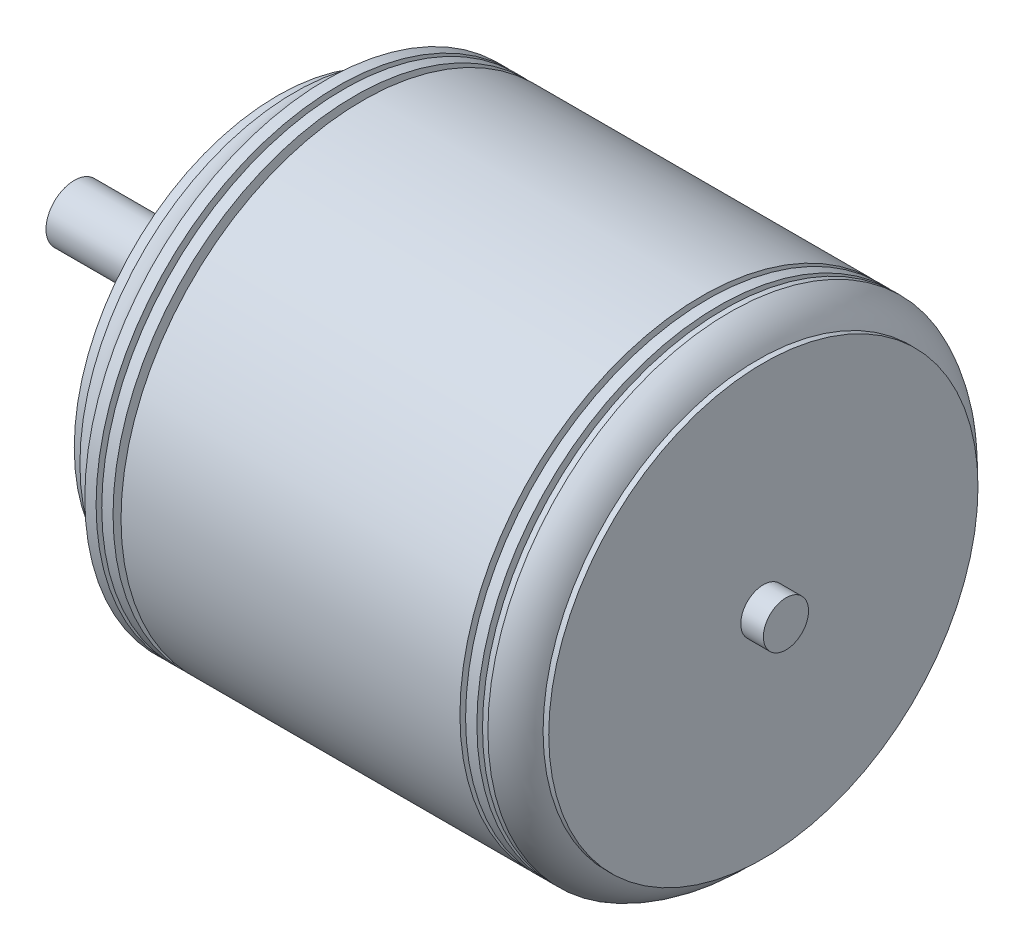
ISO-10303-21;
HEADER;
FILE_DESCRIPTION(('STEP AP214'),'2;1');
FILE_NAME('part.step','',(''),(''),'','','');
FILE_SCHEMA(('AUTOMOTIVE_DESIGN { 1 0 10303 214 1 1 1 1 }'));
ENDSEC;
DATA;
#1=APPLICATION_CONTEXT('core data for automotive mechanical design processes');
#2=APPLICATION_PROTOCOL_DEFINITION('international standard','automotive_design',2000,#1);
#3=PRODUCT_CONTEXT('',#1,'mechanical');
#4=PRODUCT('Part','Part','',(#3));
#5=PRODUCT_RELATED_PRODUCT_CATEGORY('part','',(#4));
#6=PRODUCT_DEFINITION_FORMATION('','',#4);
#7=PRODUCT_DEFINITION_CONTEXT('part definition',#1,'design');
#8=PRODUCT_DEFINITION('design','',#6,#7);
#9=PRODUCT_DEFINITION_SHAPE('','',#8);
#10=(LENGTH_UNIT() NAMED_UNIT(*) SI_UNIT(.MILLI.,.METRE.));
#11=(NAMED_UNIT(*) PLANE_ANGLE_UNIT() SI_UNIT($,.RADIAN.));
#12=(NAMED_UNIT(*) SI_UNIT($,.STERADIAN.) SOLID_ANGLE_UNIT());
#13=UNCERTAINTY_MEASURE_WITH_UNIT(LENGTH_MEASURE(1.E-05),#10,'distance_accuracy_value','');
#14=(GEOMETRIC_REPRESENTATION_CONTEXT(3) GLOBAL_UNCERTAINTY_ASSIGNED_CONTEXT((#13)) GLOBAL_UNIT_ASSIGNED_CONTEXT((#10,
#11,#12)) REPRESENTATION_CONTEXT('',''));
#15=CARTESIAN_POINT('',(0.,0.,0.));
#16=DIRECTION('',(0.,0.,1.));
#17=DIRECTION('',(1.,0.,0.));
#18=AXIS2_PLACEMENT_3D('',#15,#16,#17);
#19=CARTESIAN_POINT('',(154.955266755211,0.,0.));
#20=DIRECTION('',(-1.,0.,0.));
#21=DIRECTION('',(0.,0.,1.));
#22=AXIS2_PLACEMENT_3D('',#19,#20,#21);
#23=TOROIDAL_SURFACE('',#22,23.694590908256,4.94220442651231);
#24=CARTESIAN_POINT('',(159.332507570746,0.,0.));
#25=DIRECTION('',(-1.,0.,0.));
#26=DIRECTION('',(0.,0.,1.));
#27=AXIS2_PLACEMENT_3D('',#24,#25,#26);
#28=CIRCLE('',#27,21.4);
#29=CARTESIAN_POINT('',(159.332507570746,0.,21.4));
#30=VERTEX_POINT('',#29);
#31=EDGE_CURVE('E155',#30,#30,#28,.T.);
#32=ORIENTED_EDGE('',*,*,#31,.T.);
#33=EDGE_LOOP('',(#32));
#34=FACE_BOUND('',#33,.T.);
#35=CARTESIAN_POINT('',(156.5,0.,0.));
#36=DIRECTION('',(-1.,0.,0.));
#37=DIRECTION('',(0.,0.,1.));
#38=AXIS2_PLACEMENT_3D('',#35,#36,#37);
#39=CIRCLE('',#38,19.);
#40=CARTESIAN_POINT('',(156.5,0.,19.));
#41=VERTEX_POINT('',#40);
#42=EDGE_CURVE('E10',#41,#41,#39,.T.);
#43=ORIENTED_EDGE('',*,*,#42,.F.);
#44=EDGE_LOOP('',(#43));
#45=FACE_BOUND('',#44,.T.);
#46=ADVANCED_FACE('F44',(#34,#45),#23,.F.);
#47=CARTESIAN_POINT('',(156.5,0.,0.));
#48=DIRECTION('',(1.,0.,0.));
#49=DIRECTION('',(0.,0.,-1.));
#50=AXIS2_PLACEMENT_3D('',#47,#48,#49);
#51=PLANE('',#50);
#52=CARTESIAN_POINT('',(156.5,0.,0.));
#53=DIRECTION('',(-1.,0.,0.));
#54=DIRECTION('',(0.,0.,1.));
#55=AXIS2_PLACEMENT_3D('',#52,#53,#54);
#56=CIRCLE('',#55,18.);
#57=CARTESIAN_POINT('',(156.5,0.,18.));
#58=VERTEX_POINT('',#57);
#59=EDGE_CURVE('E51',#58,#58,#56,.T.);
#60=ORIENTED_EDGE('',*,*,#59,.F.);
#61=EDGE_LOOP('',(#60));
#62=FACE_BOUND('',#61,.T.);
#63=ORIENTED_EDGE('',*,*,#42,.T.);
#64=EDGE_LOOP('',(#63));
#65=FACE_BOUND('',#64,.T.);
#66=ADVANCED_FACE('F174',(#62,#65),#51,.F.);
#67=CARTESIAN_POINT('',(0.,0.,0.));
#68=DIRECTION('',(-1.,0.,0.));
#69=DIRECTION('',(0.,0.,1.));
#70=AXIS2_PLACEMENT_3D('',#67,#68,#69);
#71=CYLINDRICAL_SURFACE('',#70,18.);
#72=CARTESIAN_POINT('',(155.,0.,0.));
#73=DIRECTION('',(-1.,0.,0.));
#74=DIRECTION('',(0.,0.,1.));
#75=AXIS2_PLACEMENT_3D('',#72,#73,#74);
#76=CIRCLE('',#75,18.);
#77=CARTESIAN_POINT('',(155.,0.,18.));
#78=VERTEX_POINT('',#77);
#79=EDGE_CURVE('E56',#78,#78,#76,.T.);
#80=ORIENTED_EDGE('',*,*,#79,.F.);
#81=EDGE_LOOP('',(#80));
#82=FACE_BOUND('',#81,.T.);
#83=ORIENTED_EDGE('',*,*,#59,.T.);
#84=EDGE_LOOP('',(#83));
#85=FACE_BOUND('',#84,.T.);
#86=ADVANCED_FACE('F178',(#82,#85),#71,.T.);
#87=CARTESIAN_POINT('',(155.,0.,0.));
#88=DIRECTION('',(-1.,0.,0.));
#89=DIRECTION('',(0.,0.,1.));
#90=AXIS2_PLACEMENT_3D('',#87,#88,#89);
#91=PLANE('',#90);
#92=ORIENTED_EDGE('',*,*,#79,.T.);
#93=EDGE_LOOP('',(#92));
#94=FACE_BOUND('',#93,.T.);
#95=CARTESIAN_POINT('',(155.,0.,0.));
#96=DIRECTION('',(-1.,0.,0.));
#97=DIRECTION('',(0.,0.,1.));
#98=AXIS2_PLACEMENT_3D('',#95,#96,#97);
#99=CIRCLE('',#98,2.5);
#100=CARTESIAN_POINT('',(155.,0.,2.5));
#101=VERTEX_POINT('',#100);
#102=EDGE_CURVE('E61',#101,#101,#99,.T.);
#103=ORIENTED_EDGE('',*,*,#102,.F.);
#104=EDGE_LOOP('',(#103));
#105=FACE_BOUND('',#104,.T.);
#106=ADVANCED_FACE('F183',(#94,#105),#91,.T.);
#107=CARTESIAN_POINT('',(0.,0.,0.));
#108=DIRECTION('',(-1.,0.,0.));
#109=DIRECTION('',(0.,0.,1.));
#110=AXIS2_PLACEMENT_3D('',#107,#108,#109);
#111=CYLINDRICAL_SURFACE('',#110,2.5);
#112=CARTESIAN_POINT('',(137.,0.,0.));
#113=DIRECTION('',(-1.,0.,0.));
#114=DIRECTION('',(0.,0.,1.));
#115=AXIS2_PLACEMENT_3D('',#112,#113,#114);
#116=CIRCLE('',#115,2.5);
#117=CARTESIAN_POINT('',(137.,0.,2.5));
#118=VERTEX_POINT('',#117);
#119=EDGE_CURVE('E67',#118,#118,#116,.T.);
#120=ORIENTED_EDGE('',*,*,#119,.F.);
#121=EDGE_LOOP('',(#120));
#122=FACE_BOUND('',#121,.T.);
#123=ORIENTED_EDGE('',*,*,#102,.T.);
#124=EDGE_LOOP('',(#123));
#125=FACE_BOUND('',#124,.T.);
#126=ADVANCED_FACE('F189',(#122,#125),#111,.T.);
#127=CARTESIAN_POINT('',(137.,0.,0.));
#128=DIRECTION('',(1.,0.,0.));
#129=DIRECTION('',(0.,0.,-1.));
#130=AXIS2_PLACEMENT_3D('',#127,#128,#129);
#131=PLANE('',#130);
#132=ORIENTED_EDGE('',*,*,#119,.T.);
#133=EDGE_LOOP('',(#132));
#134=FACE_BOUND('',#133,.T.);
#135=ADVANCED_FACE('F193',(#134),#131,.F.);
#136=CARTESIAN_POINT('',(200.,0.,0.));
#137=DIRECTION('',(-1.,0.,0.));
#138=DIRECTION('',(0.,0.,1.));
#139=AXIS2_PLACEMENT_3D('',#136,#137,#138);
#140=PLANE('',#139);
#141=CARTESIAN_POINT('',(200.,0.,0.));
#142=DIRECTION('',(-1.,0.,0.));
#143=DIRECTION('',(0.,0.,1.));
#144=AXIS2_PLACEMENT_3D('',#141,#142,#143);
#145=CIRCLE('',#144,2.);
#146=CARTESIAN_POINT('',(200.,0.,2.));
#147=VERTEX_POINT('',#146);
#148=EDGE_CURVE('E71',#147,#147,#145,.T.);
#149=ORIENTED_EDGE('',*,*,#148,.F.);
#150=EDGE_LOOP('',(#149));
#151=FACE_BOUND('',#150,.T.);
#152=ADVANCED_FACE('F197',(#151),#140,.F.);
#153=CARTESIAN_POINT('',(0.,0.,0.));
#154=DIRECTION('',(-1.,0.,0.));
#155=DIRECTION('',(0.,0.,1.));
#156=AXIS2_PLACEMENT_3D('',#153,#154,#155);
#157=CYLINDRICAL_SURFACE('',#156,2.);
#158=CARTESIAN_POINT('',(198.,0.,0.));
#159=DIRECTION('',(-1.,0.,0.));
#160=DIRECTION('',(0.,0.,1.));
#161=AXIS2_PLACEMENT_3D('',#158,#159,#160);
#162=CIRCLE('',#161,2.);
#163=CARTESIAN_POINT('',(198.,0.,2.));
#164=VERTEX_POINT('',#163);
#165=EDGE_CURVE('E75',#164,#164,#162,.T.);
#166=ORIENTED_EDGE('',*,*,#165,.F.);
#167=EDGE_LOOP('',(#166));
#168=FACE_BOUND('',#167,.T.);
#169=ORIENTED_EDGE('',*,*,#148,.T.);
#170=EDGE_LOOP('',(#169));
#171=FACE_BOUND('',#170,.T.);
#172=ADVANCED_FACE('F201',(#168,#171),#157,.T.);
#173=CARTESIAN_POINT('',(198.,0.,0.));
#174=DIRECTION('',(-1.,0.,0.));
#175=DIRECTION('',(0.,0.,1.));
#176=AXIS2_PLACEMENT_3D('',#173,#174,#175);
#177=PLANE('',#176);
#178=CARTESIAN_POINT('',(198.,0.,0.));
#179=DIRECTION('',(-1.,0.,0.));
#180=DIRECTION('',(0.,0.,1.));
#181=AXIS2_PLACEMENT_3D('',#178,#179,#180);
#182=CIRCLE('',#181,19.);
#183=CARTESIAN_POINT('',(198.,0.,19.));
#184=VERTEX_POINT('',#183);
#185=EDGE_CURVE('E79',#184,#184,#182,.T.);
#186=ORIENTED_EDGE('',*,*,#185,.F.);
#187=EDGE_LOOP('',(#186));
#188=FACE_BOUND('',#187,.T.);
#189=ORIENTED_EDGE('',*,*,#165,.T.);
#190=EDGE_LOOP('',(#189));
#191=FACE_BOUND('',#190,.T.);
#192=ADVANCED_FACE('F205',(#188,#191),#177,.F.);
#193=CARTESIAN_POINT('',(0.,0.,0.));
#194=DIRECTION('',(-1.,0.,0.));
#195=DIRECTION('',(0.,0.,1.));
#196=AXIS2_PLACEMENT_3D('',#193,#194,#195);
#197=CYLINDRICAL_SURFACE('',#196,19.);
#198=CARTESIAN_POINT('',(197.5,0.,0.));
#199=DIRECTION('',(-1.,0.,0.));
#200=DIRECTION('',(0.,0.,1.));
#201=AXIS2_PLACEMENT_3D('',#198,#199,#200);
#202=CIRCLE('',#201,19.);
#203=CARTESIAN_POINT('',(197.5,0.,19.));
#204=VERTEX_POINT('',#203);
#205=EDGE_CURVE('E83',#204,#204,#202,.T.);
#206=ORIENTED_EDGE('',*,*,#205,.F.);
#207=EDGE_LOOP('',(#206));
#208=FACE_BOUND('',#207,.T.);
#209=ORIENTED_EDGE('',*,*,#185,.T.);
#210=EDGE_LOOP('',(#209));
#211=FACE_BOUND('',#210,.T.);
#212=ADVANCED_FACE('F209',(#208,#211),#197,.T.);
#213=CARTESIAN_POINT('',(193.370593378338,0.,0.));
#214=DIRECTION('',(-1.,0.,0.));
#215=DIRECTION('',(0.,0.,1.));
#216=AXIS2_PLACEMENT_3D('',#213,#214,#215);
#217=TOROIDAL_SURFACE('',#216,17.2117044559197,4.50000000000001);
#218=ORIENTED_EDGE('',*,*,#205,.T.);
#219=EDGE_LOOP('',(#218));
#220=FACE_BOUND('',#219,.T.);
#221=CARTESIAN_POINT('',(195.016248395478,0.,0.));
#222=DIRECTION('',(-1.,0.,0.));
#223=DIRECTION('',(0.,0.,1.));
#224=AXIS2_PLACEMENT_3D('',#221,#222,#223);
#225=CIRCLE('',#224,21.4);
#226=CARTESIAN_POINT('',(195.016248395478,0.,21.4));
#227=VERTEX_POINT('',#226);
#228=EDGE_CURVE('E87',#227,#227,#225,.T.);
#229=ORIENTED_EDGE('',*,*,#228,.F.);
#230=EDGE_LOOP('',(#229));
#231=FACE_BOUND('',#230,.T.);
#232=ADVANCED_FACE('F213',(#220,#231),#217,.T.);
#233=CARTESIAN_POINT('',(0.,0.,0.));
#234=DIRECTION('',(-1.,0.,0.));
#235=DIRECTION('',(0.,0.,1.));
#236=AXIS2_PLACEMENT_3D('',#233,#234,#235);
#237=CYLINDRICAL_SURFACE('',#236,21.4);
#238=ORIENTED_EDGE('',*,*,#228,.T.);
#239=EDGE_LOOP('',(#238));
#240=FACE_BOUND('',#239,.T.);
#241=CARTESIAN_POINT('',(194.539614351932,0.,0.));
#242=DIRECTION('',(-1.,0.,0.));
#243=DIRECTION('',(0.,0.,1.));
#244=AXIS2_PLACEMENT_3D('',#241,#242,#243);
#245=CIRCLE('',#244,21.4);
#246=CARTESIAN_POINT('',(194.539614351932,0.,21.4));
#247=VERTEX_POINT('',#246);
#248=EDGE_CURVE('E91',#247,#247,#245,.T.);
#249=ORIENTED_EDGE('',*,*,#248,.F.);
#250=EDGE_LOOP('',(#249));
#251=FACE_BOUND('',#250,.T.);
#252=ADVANCED_FACE('F217',(#240,#251),#237,.T.);
#253=CARTESIAN_POINT('',(194.539614351932,0.,0.));
#254=DIRECTION('',(-1.,0.,0.));
#255=DIRECTION('',(0.,0.,1.));
#256=AXIS2_PLACEMENT_3D('',#253,#254,#255);
#257=PLANE('',#256);
#258=ORIENTED_EDGE('',*,*,#248,.T.);
#259=EDGE_LOOP('',(#258));
#260=FACE_BOUND('',#259,.T.);
#261=CARTESIAN_POINT('',(194.539614351932,0.,0.));
#262=DIRECTION('',(-1.,0.,0.));
#263=DIRECTION('',(0.,0.,1.));
#264=AXIS2_PLACEMENT_3D('',#261,#262,#263);
#265=CIRCLE('',#264,20.4);
#266=CARTESIAN_POINT('',(194.539614351932,0.,20.4));
#267=VERTEX_POINT('',#266);
#268=EDGE_CURVE('E95',#267,#267,#265,.T.);
#269=ORIENTED_EDGE('',*,*,#268,.F.);
#270=EDGE_LOOP('',(#269));
#271=FACE_BOUND('',#270,.T.);
#272=ADVANCED_FACE('F221',(#260,#271),#257,.T.);
#273=CARTESIAN_POINT('',(0.,0.,0.));
#274=DIRECTION('',(-1.,0.,0.));
#275=DIRECTION('',(0.,0.,1.));
#276=AXIS2_PLACEMENT_3D('',#273,#274,#275);
#277=CYLINDRICAL_SURFACE('',#276,20.4);
#278=ORIENTED_EDGE('',*,*,#268,.T.);
#279=EDGE_LOOP('',(#278));
#280=FACE_BOUND('',#279,.T.);
#281=CARTESIAN_POINT('',(194.039614351932,0.,0.));
#282=DIRECTION('',(-1.,0.,0.));
#283=DIRECTION('',(0.,0.,1.));
#284=AXIS2_PLACEMENT_3D('',#281,#282,#283);
#285=CIRCLE('',#284,20.4);
#286=CARTESIAN_POINT('',(194.039614351932,0.,20.4));
#287=VERTEX_POINT('',#286);
#288=EDGE_CURVE('E99',#287,#287,#285,.T.);
#289=ORIENTED_EDGE('',*,*,#288,.F.);
#290=EDGE_LOOP('',(#289));
#291=FACE_BOUND('',#290,.T.);
#292=ADVANCED_FACE('F225',(#280,#291),#277,.T.);
#293=CARTESIAN_POINT('',(194.039614351932,0.,0.));
#294=DIRECTION('',(1.,0.,0.));
#295=DIRECTION('',(0.,0.,-1.));
#296=AXIS2_PLACEMENT_3D('',#293,#294,#295);
#297=PLANE('',#296);
#298=ORIENTED_EDGE('',*,*,#288,.T.);
#299=EDGE_LOOP('',(#298));
#300=FACE_BOUND('',#299,.T.);
#301=CARTESIAN_POINT('',(194.039614351932,0.,0.));
#302=DIRECTION('',(-1.,0.,0.));
#303=DIRECTION('',(0.,0.,1.));
#304=AXIS2_PLACEMENT_3D('',#301,#302,#303);
#305=CIRCLE('',#304,21.4);
#306=CARTESIAN_POINT('',(194.039614351932,0.,21.4));
#307=VERTEX_POINT('',#306);
#308=EDGE_CURVE('E103',#307,#307,#305,.T.);
#309=ORIENTED_EDGE('',*,*,#308,.F.);
#310=EDGE_LOOP('',(#309));
#311=FACE_BOUND('',#310,.T.);
#312=ADVANCED_FACE('F229',(#300,#311),#297,.T.);
#313=CARTESIAN_POINT('',(0.,0.,0.));
#314=DIRECTION('',(-1.,0.,0.));
#315=DIRECTION('',(0.,0.,1.));
#316=AXIS2_PLACEMENT_3D('',#313,#314,#315);
#317=CYLINDRICAL_SURFACE('',#316,21.4);
#318=ORIENTED_EDGE('',*,*,#308,.T.);
#319=EDGE_LOOP('',(#318));
#320=FACE_BOUND('',#319,.T.);
#321=CARTESIAN_POINT('',(193.039614351932,0.,0.));
#322=DIRECTION('',(-1.,0.,0.));
#323=DIRECTION('',(0.,0.,1.));
#324=AXIS2_PLACEMENT_3D('',#321,#322,#323);
#325=CIRCLE('',#324,21.4);
#326=CARTESIAN_POINT('',(193.039614351932,0.,21.4));
#327=VERTEX_POINT('',#326);
#328=EDGE_CURVE('E107',#327,#327,#325,.T.);
#329=ORIENTED_EDGE('',*,*,#328,.F.);
#330=EDGE_LOOP('',(#329));
#331=FACE_BOUND('',#330,.T.);
#332=ADVANCED_FACE('F233',(#320,#331),#317,.T.);
#333=CARTESIAN_POINT('',(193.039614351932,0.,0.));
#334=DIRECTION('',(-1.,0.,0.));
#335=DIRECTION('',(0.,0.,1.));
#336=AXIS2_PLACEMENT_3D('',#333,#334,#335);
#337=PLANE('',#336);
#338=ORIENTED_EDGE('',*,*,#328,.T.);
#339=EDGE_LOOP('',(#338));
#340=FACE_BOUND('',#339,.T.);
#341=CARTESIAN_POINT('',(193.039614351932,0.,0.));
#342=DIRECTION('',(-1.,0.,0.));
#343=DIRECTION('',(0.,0.,1.));
#344=AXIS2_PLACEMENT_3D('',#341,#342,#343);
#345=CIRCLE('',#344,20.4);
#346=CARTESIAN_POINT('',(193.039614351932,0.,20.4));
#347=VERTEX_POINT('',#346);
#348=EDGE_CURVE('E111',#347,#347,#345,.T.);
#349=ORIENTED_EDGE('',*,*,#348,.F.);
#350=EDGE_LOOP('',(#349));
#351=FACE_BOUND('',#350,.T.);
#352=ADVANCED_FACE('F237',(#340,#351),#337,.T.);
#353=CARTESIAN_POINT('',(0.,0.,0.));
#354=DIRECTION('',(-1.,0.,0.));
#355=DIRECTION('',(0.,0.,1.));
#356=AXIS2_PLACEMENT_3D('',#353,#354,#355);
#357=CYLINDRICAL_SURFACE('',#356,20.4);
#358=ORIENTED_EDGE('',*,*,#348,.T.);
#359=EDGE_LOOP('',(#358));
#360=FACE_BOUND('',#359,.T.);
#361=CARTESIAN_POINT('',(192.539614351932,0.,0.));
#362=DIRECTION('',(-1.,0.,0.));
#363=DIRECTION('',(0.,0.,1.));
#364=AXIS2_PLACEMENT_3D('',#361,#362,#363);
#365=CIRCLE('',#364,20.4);
#366=CARTESIAN_POINT('',(192.539614351932,0.,20.4));
#367=VERTEX_POINT('',#366);
#368=EDGE_CURVE('E115',#367,#367,#365,.T.);
#369=ORIENTED_EDGE('',*,*,#368,.F.);
#370=EDGE_LOOP('',(#369));
#371=FACE_BOUND('',#370,.T.);
#372=ADVANCED_FACE('F241',(#360,#371),#357,.T.);
#373=CARTESIAN_POINT('',(192.539614351932,0.,0.));
#374=DIRECTION('',(1.,0.,0.));
#375=DIRECTION('',(0.,0.,-1.));
#376=AXIS2_PLACEMENT_3D('',#373,#374,#375);
#377=PLANE('',#376);
#378=ORIENTED_EDGE('',*,*,#368,.T.);
#379=EDGE_LOOP('',(#378));
#380=FACE_BOUND('',#379,.T.);
#381=CARTESIAN_POINT('',(192.539614351932,0.,0.));
#382=DIRECTION('',(-1.,0.,0.));
#383=DIRECTION('',(0.,0.,1.));
#384=AXIS2_PLACEMENT_3D('',#381,#382,#383);
#385=CIRCLE('',#384,21.4);
#386=CARTESIAN_POINT('',(192.539614351932,0.,21.4));
#387=VERTEX_POINT('',#386);
#388=EDGE_CURVE('E119',#387,#387,#385,.T.);
#389=ORIENTED_EDGE('',*,*,#388,.F.);
#390=EDGE_LOOP('',(#389));
#391=FACE_BOUND('',#390,.T.);
#392=ADVANCED_FACE('F245',(#380,#391),#377,.T.);
#393=CARTESIAN_POINT('',(0.,0.,0.));
#394=DIRECTION('',(-1.,0.,0.));
#395=DIRECTION('',(0.,0.,1.));
#396=AXIS2_PLACEMENT_3D('',#393,#394,#395);
#397=CYLINDRICAL_SURFACE('',#396,21.4);
#398=ORIENTED_EDGE('',*,*,#388,.T.);
#399=EDGE_LOOP('',(#398));
#400=FACE_BOUND('',#399,.T.);
#401=CARTESIAN_POINT('',(162.539614351932,0.,0.));
#402=DIRECTION('',(-1.,0.,0.));
#403=DIRECTION('',(0.,0.,1.));
#404=AXIS2_PLACEMENT_3D('',#401,#402,#403);
#405=CIRCLE('',#404,21.4);
#406=CARTESIAN_POINT('',(162.539614351932,0.,21.4));
#407=VERTEX_POINT('',#406);
#408=EDGE_CURVE('E123',#407,#407,#405,.T.);
#409=ORIENTED_EDGE('',*,*,#408,.F.);
#410=EDGE_LOOP('',(#409));
#411=FACE_BOUND('',#410,.T.);
#412=ADVANCED_FACE('F249',(#400,#411),#397,.T.);
#413=CARTESIAN_POINT('',(162.539614351932,0.,0.));
#414=DIRECTION('',(-1.,0.,0.));
#415=DIRECTION('',(0.,0.,1.));
#416=AXIS2_PLACEMENT_3D('',#413,#414,#415);
#417=PLANE('',#416);
#418=ORIENTED_EDGE('',*,*,#408,.T.);
#419=EDGE_LOOP('',(#418));
#420=FACE_BOUND('',#419,.T.);
#421=CARTESIAN_POINT('',(162.539614351932,0.,0.));
#422=DIRECTION('',(-1.,0.,0.));
#423=DIRECTION('',(0.,0.,1.));
#424=AXIS2_PLACEMENT_3D('',#421,#422,#423);
#425=CIRCLE('',#424,13.2756335821309);
#426=CARTESIAN_POINT('',(162.539614351932,0.,13.2756335821309));
#427=VERTEX_POINT('',#426);
#428=EDGE_CURVE('E127',#427,#427,#425,.T.);
#429=ORIENTED_EDGE('',*,*,#428,.F.);
#430=EDGE_LOOP('',(#429));
#431=FACE_BOUND('',#430,.T.);
#432=ADVANCED_FACE('F253',(#420,#431),#417,.T.);
#433=CARTESIAN_POINT('',(161.832507570746,0.,0.));
#434=DIRECTION('',(-1.,0.,0.));
#435=DIRECTION('',(0.,0.,1.));
#436=AXIS2_PLACEMENT_3D('',#433,#434,#435);
#437=CONICAL_SURFACE('',#436,13.9827403633174,0.785398163397425);
#438=ORIENTED_EDGE('',*,*,#428,.T.);
#439=EDGE_LOOP('',(#438));
#440=FACE_BOUND('',#439,.T.);
#441=CARTESIAN_POINT('',(161.832507570746,0.,0.));
#442=DIRECTION('',(-1.,0.,0.));
#443=DIRECTION('',(0.,0.,1.));
#444=AXIS2_PLACEMENT_3D('',#441,#442,#443);
#445=CIRCLE('',#444,13.9827403633174);
#446=CARTESIAN_POINT('',(161.832507570746,0.,13.9827403633174));
#447=VERTEX_POINT('',#446);
#448=EDGE_CURVE('E131',#447,#447,#445,.T.);
#449=ORIENTED_EDGE('',*,*,#448,.F.);
#450=EDGE_LOOP('',(#449));
#451=FACE_BOUND('',#450,.T.);
#452=ADVANCED_FACE('F257',(#440,#451),#437,.T.);
#453=CARTESIAN_POINT('',(161.832507570746,0.,0.));
#454=DIRECTION('',(1.,0.,0.));
#455=DIRECTION('',(0.,0.,-1.));
#456=AXIS2_PLACEMENT_3D('',#453,#454,#455);
#457=PLANE('',#456);
#458=ORIENTED_EDGE('',*,*,#448,.T.);
#459=EDGE_LOOP('',(#458));
#460=FACE_BOUND('',#459,.T.);
#461=CARTESIAN_POINT('',(161.832507570746,0.,0.));
#462=DIRECTION('',(-1.,0.,0.));
#463=DIRECTION('',(0.,0.,1.));
#464=AXIS2_PLACEMENT_3D('',#461,#462,#463);
#465=CIRCLE('',#464,21.4);
#466=CARTESIAN_POINT('',(161.832507570746,0.,21.4));
#467=VERTEX_POINT('',#466);
#468=EDGE_CURVE('E135',#467,#467,#465,.T.);
#469=ORIENTED_EDGE('',*,*,#468,.F.);
#470=EDGE_LOOP('',(#469));
#471=FACE_BOUND('',#470,.T.);
#472=ADVANCED_FACE('F261',(#460,#471),#457,.T.);
#473=CARTESIAN_POINT('',(0.,0.,0.));
#474=DIRECTION('',(-1.,0.,0.));
#475=DIRECTION('',(0.,0.,1.));
#476=AXIS2_PLACEMENT_3D('',#473,#474,#475);
#477=CYLINDRICAL_SURFACE('',#476,21.4);
#478=ORIENTED_EDGE('',*,*,#468,.T.);
#479=EDGE_LOOP('',(#478));
#480=FACE_BOUND('',#479,.T.);
#481=CARTESIAN_POINT('',(160.832507570746,0.,0.));
#482=DIRECTION('',(-1.,0.,0.));
#483=DIRECTION('',(0.,0.,1.));
#484=AXIS2_PLACEMENT_3D('',#481,#482,#483);
#485=CIRCLE('',#484,21.4);
#486=CARTESIAN_POINT('',(160.832507570746,0.,21.4));
#487=VERTEX_POINT('',#486);
#488=EDGE_CURVE('E139',#487,#487,#485,.T.);
#489=ORIENTED_EDGE('',*,*,#488,.F.);
#490=EDGE_LOOP('',(#489));
#491=FACE_BOUND('',#490,.T.);
#492=ADVANCED_FACE('F265',(#480,#491),#477,.T.);
#493=CARTESIAN_POINT('',(160.832507570746,0.,0.));
#494=DIRECTION('',(-1.,0.,0.));
#495=DIRECTION('',(0.,0.,1.));
#496=AXIS2_PLACEMENT_3D('',#493,#494,#495);
#497=PLANE('',#496);
#498=ORIENTED_EDGE('',*,*,#488,.T.);
#499=EDGE_LOOP('',(#498));
#500=FACE_BOUND('',#499,.T.);
#501=CARTESIAN_POINT('',(160.832507570746,0.,0.));
#502=DIRECTION('',(-1.,0.,0.));
#503=DIRECTION('',(0.,0.,1.));
#504=AXIS2_PLACEMENT_3D('',#501,#502,#503);
#505=CIRCLE('',#504,20.4);
#506=CARTESIAN_POINT('',(160.832507570746,0.,20.4));
#507=VERTEX_POINT('',#506);
#508=EDGE_CURVE('E143',#507,#507,#505,.T.);
#509=ORIENTED_EDGE('',*,*,#508,.F.);
#510=EDGE_LOOP('',(#509));
#511=FACE_BOUND('',#510,.T.);
#512=ADVANCED_FACE('F269',(#500,#511),#497,.T.);
#513=CARTESIAN_POINT('',(0.,0.,0.));
#514=DIRECTION('',(-1.,0.,0.));
#515=DIRECTION('',(0.,0.,1.));
#516=AXIS2_PLACEMENT_3D('',#513,#514,#515);
#517=CYLINDRICAL_SURFACE('',#516,20.4);
#518=ORIENTED_EDGE('',*,*,#508,.T.);
#519=EDGE_LOOP('',(#518));
#520=FACE_BOUND('',#519,.T.);
#521=CARTESIAN_POINT('',(160.332507570746,0.,0.));
#522=DIRECTION('',(-1.,0.,0.));
#523=DIRECTION('',(0.,0.,1.));
#524=AXIS2_PLACEMENT_3D('',#521,#522,#523);
#525=CIRCLE('',#524,20.4);
#526=CARTESIAN_POINT('',(160.332507570746,0.,20.4));
#527=VERTEX_POINT('',#526);
#528=EDGE_CURVE('E147',#527,#527,#525,.T.);
#529=ORIENTED_EDGE('',*,*,#528,.F.);
#530=EDGE_LOOP('',(#529));
#531=FACE_BOUND('',#530,.T.);
#532=ADVANCED_FACE('F170',(#520,#531),#517,.T.);
#533=CARTESIAN_POINT('',(160.332507570746,0.,0.));
#534=DIRECTION('',(1.,0.,0.));
#535=DIRECTION('',(0.,0.,-1.));
#536=AXIS2_PLACEMENT_3D('',#533,#534,#535);
#537=PLANE('',#536);
#538=ORIENTED_EDGE('',*,*,#528,.T.);
#539=EDGE_LOOP('',(#538));
#540=FACE_BOUND('',#539,.T.);
#541=CARTESIAN_POINT('',(160.332507570746,0.,0.));
#542=DIRECTION('',(-1.,0.,0.));
#543=DIRECTION('',(0.,0.,1.));
#544=AXIS2_PLACEMENT_3D('',#541,#542,#543);
#545=CIRCLE('',#544,21.4);
#546=CARTESIAN_POINT('',(160.332507570746,0.,21.4));
#547=VERTEX_POINT('',#546);
#548=EDGE_CURVE('E151',#547,#547,#545,.T.);
#549=ORIENTED_EDGE('',*,*,#548,.F.);
#550=EDGE_LOOP('',(#549));
#551=FACE_BOUND('',#550,.T.);
#552=ADVANCED_FACE('F164',(#540,#551),#537,.T.);
#553=CARTESIAN_POINT('',(0.,0.,0.));
#554=DIRECTION('',(-1.,0.,0.));
#555=DIRECTION('',(0.,0.,1.));
#556=AXIS2_PLACEMENT_3D('',#553,#554,#555);
#557=CYLINDRICAL_SURFACE('',#556,21.4);
#558=ORIENTED_EDGE('',*,*,#548,.T.);
#559=EDGE_LOOP('',(#558));
#560=FACE_BOUND('',#559,.T.);
#561=ORIENTED_EDGE('',*,*,#31,.F.);
#562=EDGE_LOOP('',(#561));
#563=FACE_BOUND('',#562,.T.);
#564=ADVANCED_FACE('F162',(#560,#563),#557,.T.);
#565=CLOSED_SHELL('',(#46,#66,#86,#106,#126,#135,#152,#172,#192,#212,#232,#252,#272,#292,#312,
#332,#352,#372,#392,#412,#432,#452,#472,#492,#512,#532,#552,#564));
#566=MANIFOLD_SOLID_BREP('B2',#565);
#567=ADVANCED_BREP_SHAPE_REPRESENTATION('',(#18,#566),#14);
#568=SHAPE_DEFINITION_REPRESENTATION(#9,#567);
ENDSEC;
END-ISO-10303-21;
